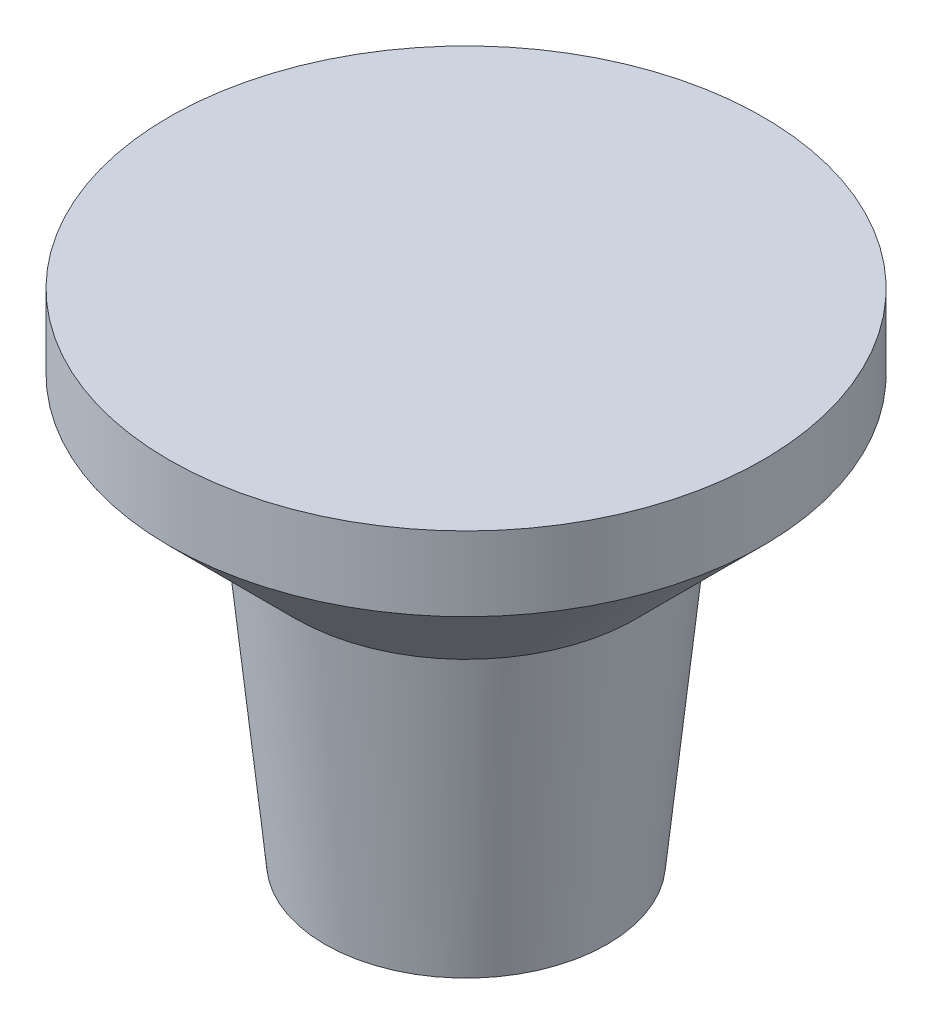
ISO-10303-21;
HEADER;
FILE_DESCRIPTION(('STEP AP214'),'2;1');
FILE_NAME('part.step','',(''),(''),'','','');
FILE_SCHEMA(('AUTOMOTIVE_DESIGN { 1 0 10303 214 1 1 1 1 }'));
ENDSEC;
DATA;
#1=APPLICATION_CONTEXT('core data for automotive mechanical design processes');
#2=APPLICATION_PROTOCOL_DEFINITION('international standard','automotive_design',2000,#1);
#3=PRODUCT_CONTEXT('',#1,'mechanical');
#4=PRODUCT('Part','Part','',(#3));
#5=PRODUCT_RELATED_PRODUCT_CATEGORY('part','',(#4));
#6=PRODUCT_DEFINITION_FORMATION('','',#4);
#7=PRODUCT_DEFINITION_CONTEXT('part definition',#1,'design');
#8=PRODUCT_DEFINITION('design','',#6,#7);
#9=PRODUCT_DEFINITION_SHAPE('','',#8);
#10=(LENGTH_UNIT() NAMED_UNIT(*) SI_UNIT(.MILLI.,.METRE.));
#11=(NAMED_UNIT(*) PLANE_ANGLE_UNIT() SI_UNIT($,.RADIAN.));
#12=(NAMED_UNIT(*) SI_UNIT($,.STERADIAN.) SOLID_ANGLE_UNIT());
#13=UNCERTAINTY_MEASURE_WITH_UNIT(LENGTH_MEASURE(1.E-05),#10,'distance_accuracy_value','');
#14=(GEOMETRIC_REPRESENTATION_CONTEXT(3) GLOBAL_UNCERTAINTY_ASSIGNED_CONTEXT((#13)) GLOBAL_UNIT_ASSIGNED_CONTEXT((#10,
#11,#12)) REPRESENTATION_CONTEXT('',''));
#15=CARTESIAN_POINT('',(0.,0.,0.));
#16=DIRECTION('',(0.,0.,1.));
#17=DIRECTION('',(1.,0.,0.));
#18=AXIS2_PLACEMENT_3D('',#15,#16,#17);
#19=CARTESIAN_POINT('',(0.,0.,0.));
#20=DIRECTION('',(0.,1.,0.));
#21=DIRECTION('',(0.,0.,1.));
#22=AXIS2_PLACEMENT_3D('',#19,#20,#21);
#23=PLANE('',#22);
#24=CARTESIAN_POINT('',(0.,0.,0.));
#25=DIRECTION('',(0.,1.,0.));
#26=DIRECTION('',(0.,0.,1.));
#27=AXIS2_PLACEMENT_3D('',#24,#25,#26);
#28=CIRCLE('',#27,3.8);
#29=CARTESIAN_POINT('',(0.,0.,3.8));
#30=VERTEX_POINT('',#29);
#31=EDGE_CURVE('E10',#30,#30,#28,.T.);
#32=ORIENTED_EDGE('',*,*,#31,.F.);
#33=EDGE_LOOP('',(#32));
#34=FACE_BOUND('',#33,.T.);
#35=ADVANCED_FACE('F31',(#34),#23,.F.);
#36=CARTESIAN_POINT('',(0.,0.,0.));
#37=DIRECTION('',(0.,1.,0.));
#38=DIRECTION('',(0.,0.,1.));
#39=AXIS2_PLACEMENT_3D('',#36,#37,#38);
#40=CONICAL_SURFACE('',#39,3.8,0.0996686524911623);
#41=CARTESIAN_POINT('',(0.,8.,0.));
#42=DIRECTION('',(0.,1.,0.));
#43=DIRECTION('',(0.,0.,1.));
#44=AXIS2_PLACEMENT_3D('',#41,#42,#43);
#45=CIRCLE('',#44,4.6);
#46=CARTESIAN_POINT('',(0.,8.,4.6));
#47=VERTEX_POINT('',#46);
#48=EDGE_CURVE('E37',#47,#47,#45,.T.);
#49=ORIENTED_EDGE('',*,*,#48,.F.);
#50=EDGE_LOOP('',(#49));
#51=FACE_BOUND('',#50,.T.);
#52=ORIENTED_EDGE('',*,*,#31,.T.);
#53=EDGE_LOOP('',(#52));
#54=FACE_BOUND('',#53,.T.);
#55=ADVANCED_FACE('F61',(#51,#54),#40,.T.);
#56=CARTESIAN_POINT('',(0.,8.,0.));
#57=DIRECTION('',(0.,1.,0.));
#58=DIRECTION('',(0.,0.,1.));
#59=AXIS2_PLACEMENT_3D('',#56,#57,#58);
#60=CONICAL_SURFACE('',#59,4.6,0.785398163397442);
#61=CARTESIAN_POINT('',(0.,11.4,0.));
#62=DIRECTION('',(0.,1.,0.));
#63=DIRECTION('',(0.,0.,1.));
#64=AXIS2_PLACEMENT_3D('',#61,#62,#63);
#65=CIRCLE('',#64,8.00000000000001);
#66=CARTESIAN_POINT('',(0.,11.4,8.00000000000001));
#67=VERTEX_POINT('',#66);
#68=EDGE_CURVE('E41',#67,#67,#65,.T.);
#69=ORIENTED_EDGE('',*,*,#68,.F.);
#70=EDGE_LOOP('',(#69));
#71=FACE_BOUND('',#70,.T.);
#72=ORIENTED_EDGE('',*,*,#48,.T.);
#73=EDGE_LOOP('',(#72));
#74=FACE_BOUND('',#73,.T.);
#75=ADVANCED_FACE('F56',(#71,#74),#60,.T.);
#76=CARTESIAN_POINT('',(0.,55.,0.));
#77=DIRECTION('',(0.,1.,0.));
#78=DIRECTION('',(0.,0.,1.));
#79=AXIS2_PLACEMENT_3D('',#76,#77,#78);
#80=CYLINDRICAL_SURFACE('',#79,8.00000000000001);
#81=CARTESIAN_POINT('',(0.,13.4000000000001,0.));
#82=DIRECTION('',(0.,1.,0.));
#83=DIRECTION('',(0.,0.,1.));
#84=AXIS2_PLACEMENT_3D('',#81,#82,#83);
#85=CIRCLE('',#84,8.00000000000001);
#86=CARTESIAN_POINT('',(0.,13.4000000000001,8.00000000000001));
#87=VERTEX_POINT('',#86);
#88=EDGE_CURVE('E45',#87,#87,#85,.T.);
#89=ORIENTED_EDGE('',*,*,#88,.F.);
#90=EDGE_LOOP('',(#89));
#91=FACE_BOUND('',#90,.T.);
#92=ORIENTED_EDGE('',*,*,#68,.T.);
#93=EDGE_LOOP('',(#92));
#94=FACE_BOUND('',#93,.T.);
#95=ADVANCED_FACE('F53',(#91,#94),#80,.T.);
#96=CARTESIAN_POINT('',(8.00000000000001,13.4,0.));
#97=DIRECTION('',(0.,-1.,0.));
#98=DIRECTION('',(0.,0.,-1.));
#99=AXIS2_PLACEMENT_3D('',#96,#97,#98);
#100=PLANE('',#99);
#101=ORIENTED_EDGE('',*,*,#88,.T.);
#102=EDGE_LOOP('',(#101));
#103=FACE_BOUND('',#102,.T.);
#104=ADVANCED_FACE('F51',(#103),#100,.F.);
#105=CLOSED_SHELL('',(#35,#55,#75,#95,#104));
#106=MANIFOLD_SOLID_BREP('B2',#105);
#107=ADVANCED_BREP_SHAPE_REPRESENTATION('',(#18,#106),#14);
#108=SHAPE_DEFINITION_REPRESENTATION(#9,#107);
ENDSEC;
END-ISO-10303-21;
